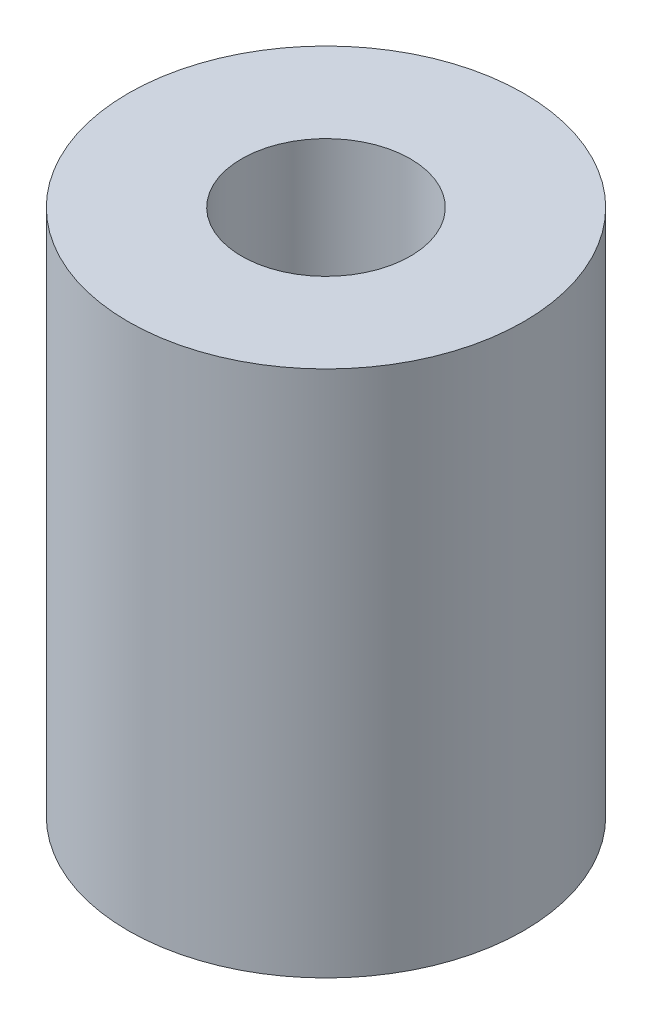
ISO-10303-21;
HEADER;
FILE_DESCRIPTION(('STEP AP214'),'2;1');
FILE_NAME('part.step','',(''),(''),'','','');
FILE_SCHEMA(('AUTOMOTIVE_DESIGN { 1 0 10303 214 1 1 1 1 }'));
ENDSEC;
DATA;
#1=APPLICATION_CONTEXT('core data for automotive mechanical design processes');
#2=APPLICATION_PROTOCOL_DEFINITION('international standard','automotive_design',2000,#1);
#3=PRODUCT_CONTEXT('',#1,'mechanical');
#4=PRODUCT('Part','Part','',(#3));
#5=PRODUCT_RELATED_PRODUCT_CATEGORY('part','',(#4));
#6=PRODUCT_DEFINITION_FORMATION('','',#4);
#7=PRODUCT_DEFINITION_CONTEXT('part definition',#1,'design');
#8=PRODUCT_DEFINITION('design','',#6,#7);
#9=PRODUCT_DEFINITION_SHAPE('','',#8);
#10=(LENGTH_UNIT() NAMED_UNIT(*) SI_UNIT(.MILLI.,.METRE.));
#11=(NAMED_UNIT(*) PLANE_ANGLE_UNIT() SI_UNIT($,.RADIAN.));
#12=(NAMED_UNIT(*) SI_UNIT($,.STERADIAN.) SOLID_ANGLE_UNIT());
#13=UNCERTAINTY_MEASURE_WITH_UNIT(LENGTH_MEASURE(1.E-05),#10,'distance_accuracy_value','');
#14=(GEOMETRIC_REPRESENTATION_CONTEXT(3) GLOBAL_UNCERTAINTY_ASSIGNED_CONTEXT((#13)) GLOBAL_UNIT_ASSIGNED_CONTEXT((#10,
#11,#12)) REPRESENTATION_CONTEXT('',''));
#15=CARTESIAN_POINT('',(0.,0.,0.));
#16=DIRECTION('',(0.,0.,1.));
#17=DIRECTION('',(1.,0.,0.));
#18=AXIS2_PLACEMENT_3D('',#15,#16,#17);
#19=CARTESIAN_POINT('',(0.,12.7,0.));
#20=DIRECTION('',(0.,1.,0.));
#21=DIRECTION('',(0.,0.,-1.));
#22=AXIS2_PLACEMENT_3D('',#19,#20,#21);
#23=PLANE('',#22);
#24=CARTESIAN_POINT('',(0.,12.7,0.));
#25=DIRECTION('',(0.,-1.,0.));
#26=DIRECTION('',(0.,0.,-1.));
#27=AXIS2_PLACEMENT_3D('',#24,#25,#26);
#28=CIRCLE('',#27,4.7625);
#29=CARTESIAN_POINT('',(0.,12.7,-4.7625));
#30=VERTEX_POINT('',#29);
#31=EDGE_CURVE('E10',#30,#30,#28,.T.);
#32=ORIENTED_EDGE('',*,*,#31,.F.);
#33=EDGE_LOOP('',(#32));
#34=FACE_BOUND('',#33,.T.);
#35=CARTESIAN_POINT('',(0.,12.7,0.));
#36=DIRECTION('',(0.,-1.,0.));
#37=DIRECTION('',(0.,0.,-1.));
#38=AXIS2_PLACEMENT_3D('',#35,#36,#37);
#39=CIRCLE('',#38,2.032);
#40=CARTESIAN_POINT('',(0.,12.7,-2.032));
#41=VERTEX_POINT('',#40);
#42=EDGE_CURVE('E50',#41,#41,#39,.T.);
#43=ORIENTED_EDGE('',*,*,#42,.T.);
#44=EDGE_LOOP('',(#43));
#45=FACE_BOUND('',#44,.T.);
#46=ADVANCED_FACE('F39',(#34,#45),#23,.T.);
#47=CARTESIAN_POINT('',(0.,0.,0.));
#48=DIRECTION('',(0.,1.,0.));
#49=DIRECTION('',(0.,0.,-1.));
#50=AXIS2_PLACEMENT_3D('',#47,#48,#49);
#51=PLANE('',#50);
#52=CARTESIAN_POINT('',(0.,0.,0.));
#53=DIRECTION('',(0.,-1.,0.));
#54=DIRECTION('',(0.,0.,-1.));
#55=AXIS2_PLACEMENT_3D('',#52,#53,#54);
#56=CIRCLE('',#55,4.7625);
#57=CARTESIAN_POINT('',(0.,0.,-4.7625));
#58=VERTEX_POINT('',#57);
#59=EDGE_CURVE('E43',#58,#58,#56,.T.);
#60=ORIENTED_EDGE('',*,*,#59,.T.);
#61=EDGE_LOOP('',(#60));
#62=FACE_BOUND('',#61,.T.);
#63=CARTESIAN_POINT('',(0.,0.,0.));
#64=DIRECTION('',(0.,-1.,0.));
#65=DIRECTION('',(0.,0.,-1.));
#66=AXIS2_PLACEMENT_3D('',#63,#64,#65);
#67=CIRCLE('',#66,2.032);
#68=CARTESIAN_POINT('',(0.,0.,-2.032));
#69=VERTEX_POINT('',#68);
#70=EDGE_CURVE('E52',#69,#69,#67,.T.);
#71=ORIENTED_EDGE('',*,*,#70,.F.);
#72=EDGE_LOOP('',(#71));
#73=FACE_BOUND('',#72,.T.);
#74=ADVANCED_FACE('F65',(#62,#73),#51,.F.);
#75=CARTESIAN_POINT('',(0.,12.7,0.));
#76=DIRECTION('',(0.,-1.,0.));
#77=DIRECTION('',(0.,0.,1.));
#78=AXIS2_PLACEMENT_3D('',#75,#76,#77);
#79=CYLINDRICAL_SURFACE('',#78,4.7625);
#80=ORIENTED_EDGE('',*,*,#31,.T.);
#81=EDGE_LOOP('',(#80));
#82=FACE_BOUND('',#81,.T.);
#83=ORIENTED_EDGE('',*,*,#59,.F.);
#84=EDGE_LOOP('',(#83));
#85=FACE_BOUND('',#84,.T.);
#86=ADVANCED_FACE('F41',(#82,#85),#79,.T.);
#87=CARTESIAN_POINT('',(0.,12.7,0.));
#88=DIRECTION('',(0.,-1.,0.));
#89=DIRECTION('',(0.,0.,1.));
#90=AXIS2_PLACEMENT_3D('',#87,#88,#89);
#91=CYLINDRICAL_SURFACE('',#90,2.032);
#92=ORIENTED_EDGE('',*,*,#42,.F.);
#93=EDGE_LOOP('',(#92));
#94=FACE_BOUND('',#93,.T.);
#95=ORIENTED_EDGE('',*,*,#70,.T.);
#96=EDGE_LOOP('',(#95));
#97=FACE_BOUND('',#96,.T.);
#98=ADVANCED_FACE('F59',(#94,#97),#91,.F.);
#99=CLOSED_SHELL('',(#46,#74,#86,#98));
#100=MANIFOLD_SOLID_BREP('B2',#99);
#101=ADVANCED_BREP_SHAPE_REPRESENTATION('',(#18,#100),#14);
#102=SHAPE_DEFINITION_REPRESENTATION(#9,#101);
ENDSEC;
END-ISO-10303-21;
